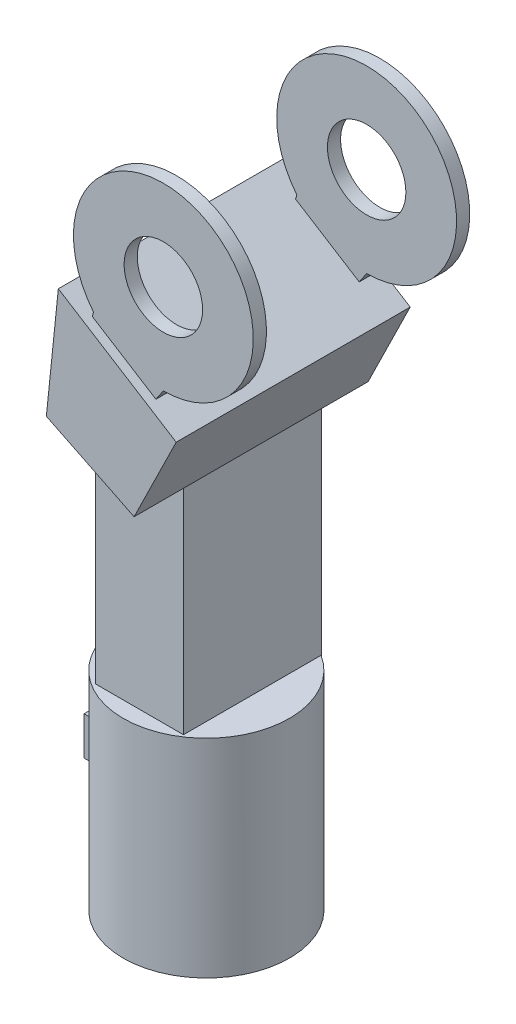
ISO-10303-21;
HEADER;
FILE_DESCRIPTION(('STEP AP214'),'2;1');
FILE_NAME('part.step','',(''),(''),'','','');
FILE_SCHEMA(('AUTOMOTIVE_DESIGN { 1 0 10303 214 1 1 1 1 }'));
ENDSEC;
DATA;
#1=APPLICATION_CONTEXT('core data for automotive mechanical design processes');
#2=APPLICATION_PROTOCOL_DEFINITION('international standard','automotive_design',2000,#1);
#3=PRODUCT_CONTEXT('',#1,'mechanical');
#4=PRODUCT('Part','Part','',(#3));
#5=PRODUCT_RELATED_PRODUCT_CATEGORY('part','',(#4));
#6=PRODUCT_DEFINITION_FORMATION('','',#4);
#7=PRODUCT_DEFINITION_CONTEXT('part definition',#1,'design');
#8=PRODUCT_DEFINITION('design','',#6,#7);
#9=PRODUCT_DEFINITION_SHAPE('','',#8);
#10=(LENGTH_UNIT() NAMED_UNIT(*) SI_UNIT(.MILLI.,.METRE.));
#11=(NAMED_UNIT(*) PLANE_ANGLE_UNIT() SI_UNIT($,.RADIAN.));
#12=(NAMED_UNIT(*) SI_UNIT($,.STERADIAN.) SOLID_ANGLE_UNIT());
#13=UNCERTAINTY_MEASURE_WITH_UNIT(LENGTH_MEASURE(1.E-05),#10,'distance_accuracy_value','');
#14=(GEOMETRIC_REPRESENTATION_CONTEXT(3) GLOBAL_UNCERTAINTY_ASSIGNED_CONTEXT((#13)) GLOBAL_UNIT_ASSIGNED_CONTEXT((#10,
#11,#12)) REPRESENTATION_CONTEXT('',''));
#15=CARTESIAN_POINT('',(0.,0.,0.));
#16=DIRECTION('',(0.,0.,1.));
#17=DIRECTION('',(1.,0.,0.));
#18=AXIS2_PLACEMENT_3D('',#15,#16,#17);
#19=CARTESIAN_POINT('',(-0.0329085029661655,-0.0154652502387762,-0.04));
#20=DIRECTION('',(0.531346970480466,0.847154293479783,0.));
#21=DIRECTION('',(-0.847154293479783,0.531346970480467,0.));
#22=AXIS2_PLACEMENT_3D('',#19,#20,#21);
#23=PLANE('',#22);
#24=DIRECTION('',(0.,0.,1.));
#25=VECTOR('',#24,1.);
#26=CARTESIAN_POINT('',(-0.0329085029661655,-0.0154652502387762,-0.04));
#27=LINE('',#26,#25);
#28=CARTESIAN_POINT('',(-0.0329085029661655,-0.0154652502387762,-0.04));
#29=VERTEX_POINT('',#28);
#30=CARTESIAN_POINT('',(-0.0329085029661655,-0.0154652502387762,0.04));
#31=VERTEX_POINT('',#30);
#32=EDGE_CURVE('E299',#29,#31,#27,.T.);
#33=ORIENTED_EDGE('',*,*,#32,.T.);
#34=DIRECTION('',(-0.847154293479783,0.531346970480467,0.));
#35=VECTOR('',#34,1.);
#36=CARTESIAN_POINT('',(-0.0329085029661655,-0.0154652502387762,0.04));
#37=LINE('',#36,#35);
#38=CARTESIAN_POINT('',(0.00739371812171949,-0.0407433645604535,0.04));
#39=VERTEX_POINT('',#38);
#40=EDGE_CURVE('E275',#39,#31,#37,.T.);
#41=ORIENTED_EDGE('',*,*,#40,.F.);
#42=DIRECTION('',(0.,0.,1.));
#43=VECTOR('',#42,1.);
#44=CARTESIAN_POINT('',(0.00739371812171949,-0.0407433645604535,-0.04));
#45=LINE('',#44,#43);
#46=CARTESIAN_POINT('',(0.00739371812171949,-0.0407433645604535,-0.04));
#47=VERTEX_POINT('',#46);
#48=EDGE_CURVE('E300',#47,#39,#45,.T.);
#49=ORIENTED_EDGE('',*,*,#48,.F.);
#50=DIRECTION('',(-0.847154293479783,0.531346970480467,0.));
#51=VECTOR('',#50,1.);
#52=CARTESIAN_POINT('',(-0.0329085029661655,-0.0154652502387762,-0.04));
#53=LINE('',#52,#51);
#54=EDGE_CURVE('E287',#47,#29,#53,.T.);
#55=ORIENTED_EDGE('',*,*,#54,.T.);
#56=EDGE_LOOP('',(#33,#41,#49,#55));
#57=FACE_BOUND('',#56,.T.);
#58=DIRECTION('',(0.847154293479783,-0.531346970480466,0.));
#59=VECTOR('',#58,1.);
#60=CARTESIAN_POINT('',(-0.0242840435920477,-0.0208746312638618,0.0325));
#61=LINE('',#60,#59);
#62=CARTESIAN_POINT('',(-0.0242840435920477,-0.0208746312638618,0.0325));
#63=VERTEX_POINT('',#62);
#64=CARTESIAN_POINT('',(-0.00254769704776513,-0.0345079705203709,0.0325));
#65=VERTEX_POINT('',#64);
#66=EDGE_CURVE('E242',#63,#65,#61,.T.);
#67=ORIENTED_EDGE('',*,*,#66,.T.);
#68=DIRECTION('',(0.,0.,-1.));
#69=VECTOR('',#68,1.);
#70=CARTESIAN_POINT('',(-0.00254769704776513,-0.0345079705203709,0.037));
#71=LINE('',#70,#69);
#72=CARTESIAN_POINT('',(-0.00254769704776513,-0.0345079705203709,0.037));
#73=VERTEX_POINT('',#72);
#74=EDGE_CURVE('E272',#73,#65,#71,.T.);
#75=ORIENTED_EDGE('',*,*,#74,.F.);
#76=DIRECTION('',(0.847154293479783,-0.531346970480466,0.));
#77=VECTOR('',#76,1.);
#78=CARTESIAN_POINT('',(-0.0242840435920477,-0.0208746312638618,0.037));
#79=LINE('',#78,#77);
#80=CARTESIAN_POINT('',(-0.0242840435920477,-0.0208746312638618,0.037));
#81=VERTEX_POINT('',#80);
#82=EDGE_CURVE('E245',#81,#73,#79,.T.);
#83=ORIENTED_EDGE('',*,*,#82,.F.);
#84=DIRECTION('',(0.,0.,-1.));
#85=VECTOR('',#84,1.);
#86=CARTESIAN_POINT('',(-0.0242840435920477,-0.0208746312638618,0.037));
#87=LINE('',#86,#85);
#88=EDGE_CURVE('E255',#81,#63,#87,.T.);
#89=ORIENTED_EDGE('',*,*,#88,.T.);
#90=EDGE_LOOP('',(#67,#75,#83,#89));
#91=FACE_BOUND('',#90,.T.);
#92=DIRECTION('',(0.,0.,1.));
#93=VECTOR('',#92,1.);
#94=CARTESIAN_POINT('',(-0.0242840435920477,-0.0208746312638618,-0.037));
#95=LINE('',#94,#93);
#96=CARTESIAN_POINT('',(-0.0242840435920477,-0.0208746312638618,-0.037));
#97=VERTEX_POINT('',#96);
#98=CARTESIAN_POINT('',(-0.0242840435920477,-0.0208746312638619,-0.0325));
#99=VERTEX_POINT('',#98);
#100=EDGE_CURVE('E54',#97,#99,#95,.T.);
#101=ORIENTED_EDGE('',*,*,#100,.F.);
#102=DIRECTION('',(0.847154293479783,-0.531346970480466,0.));
#103=VECTOR('',#102,1.);
#104=CARTESIAN_POINT('',(-0.0242840435920477,-0.0208746312638618,-0.037));
#105=LINE('',#104,#103);
#106=CARTESIAN_POINT('',(-0.00254769704776513,-0.0345079705203709,-0.037));
#107=VERTEX_POINT('',#106);
#108=EDGE_CURVE('E58',#97,#107,#105,.T.);
#109=ORIENTED_EDGE('',*,*,#108,.T.);
#110=DIRECTION('',(0.,0.,1.));
#111=VECTOR('',#110,1.);
#112=CARTESIAN_POINT('',(-0.00254769704776513,-0.0345079705203709,-0.037));
#113=LINE('',#112,#111);
#114=CARTESIAN_POINT('',(-0.00254769704776513,-0.0345079705203709,-0.0325));
#115=VERTEX_POINT('',#114);
#116=EDGE_CURVE('E210',#107,#115,#113,.T.);
#117=ORIENTED_EDGE('',*,*,#116,.T.);
#118=DIRECTION('',(0.847154293479783,-0.531346970480466,0.));
#119=VECTOR('',#118,1.);
#120=CARTESIAN_POINT('',(-0.0242840435920477,-0.0208746312638618,-0.0325));
#121=LINE('',#120,#119);
#122=EDGE_CURVE('E226',#99,#115,#121,.T.);
#123=ORIENTED_EDGE('',*,*,#122,.F.);
#124=EDGE_LOOP('',(#101,#109,#117,#123));
#125=FACE_BOUND('',#124,.T.);
#126=ADVANCED_FACE('F39',(#57,#91,#125),#23,.T.);
#127=CARTESIAN_POINT('',(-0.037,-0.0502420734633802,-0.0239939150373754));
#128=DIRECTION('',(0.,0.,-1.));
#129=DIRECTION('',(0.,1.,0.));
#130=AXIS2_PLACEMENT_3D('',#127,#128,#129);
#131=PLANE('',#130);
#132=DIRECTION('',(-0.897431435287062,0.441153962873058,0.));
#133=VECTOR('',#132,1.);
#134=CARTESIAN_POINT('',(-0.0389933634476772,-0.0542971362542646,-0.0239939150373754));
#135=LINE('',#134,#133);
#136=CARTESIAN_POINT('',(-0.007,-0.0700242419869339,-0.0239939150373754));
#137=VERTEX_POINT('',#136);
#138=CARTESIAN_POINT('',(-0.037,-0.0552770219032533,-0.0239939150373754));
#139=VERTEX_POINT('',#138);
#140=EDGE_CURVE('E314',#137,#139,#135,.T.);
#141=ORIENTED_EDGE('',*,*,#140,.F.);
#142=DIRECTION('',(0.,1.,0.));
#143=VECTOR('',#142,1.);
#144=CARTESIAN_POINT('',(-0.007,-0.0502420734633802,-0.0239939150373754));
#145=LINE('',#144,#143);
#146=CARTESIAN_POINT('',(-0.007,-0.145713330056196,-0.0239939150373754));
#147=VERTEX_POINT('',#146);
#148=EDGE_CURVE('E322',#147,#137,#145,.T.);
#149=ORIENTED_EDGE('',*,*,#148,.F.);
#150=DIRECTION('',(1.,0.,0.));
#151=VECTOR('',#150,1.);
#152=CARTESIAN_POINT('',(-0.037,-0.145713330056196,-0.0239939150373754));
#153=LINE('',#152,#151);
#154=CARTESIAN_POINT('',(-0.00713140976190437,-0.145713330056196,-0.0239939150373754));
#155=VERTEX_POINT('',#154);
#156=EDGE_CURVE('E342',#155,#147,#153,.T.);
#157=ORIENTED_EDGE('',*,*,#156,.F.);
#158=DIRECTION('',(0.,1.,0.));
#159=VECTOR('',#158,1.);
#160=CARTESIAN_POINT('',(-0.00713140976190438,-0.214,-0.0239939150373754));
#161=LINE('',#160,#159);
#162=CARTESIAN_POINT('',(-0.00713140976190437,-0.143,-0.0239939150373754));
#163=VERTEX_POINT('',#162);
#164=EDGE_CURVE('E352',#155,#163,#161,.T.);
#165=ORIENTED_EDGE('',*,*,#164,.T.);
#166=DIRECTION('',(-1.,0.,0.));
#167=VECTOR('',#166,1.);
#168=CARTESIAN_POINT('',(-0.0221553616629709,-0.143,-0.0239939150373754));
#169=LINE('',#168,#167);
#170=CARTESIAN_POINT('',(-0.037,-0.143,-0.0239939150373754));
#171=VERTEX_POINT('',#170);
#172=EDGE_CURVE('E405',#163,#171,#169,.T.);
#173=ORIENTED_EDGE('',*,*,#172,.T.);
#174=DIRECTION('',(0.,1.,0.));
#175=VECTOR('',#174,1.);
#176=CARTESIAN_POINT('',(-0.037,-0.0502420734633802,-0.0239939150373754));
#177=LINE('',#176,#175);
#178=EDGE_CURVE('E323',#171,#139,#177,.T.);
#179=ORIENTED_EDGE('',*,*,#178,.T.);
#180=EDGE_LOOP('',(#141,#149,#157,#165,#173,#179));
#181=FACE_BOUND('',#180,.T.);
#182=ADVANCED_FACE('F416',(#181),#131,.T.);
#183=CARTESIAN_POINT('',(-0.037,-0.0502420734633802,0.0231195869559997));
#184=DIRECTION('',(0.,0.,1.));
#185=DIRECTION('',(1.,0.,0.));
#186=AXIS2_PLACEMENT_3D('',#183,#184,#185);
#187=PLANE('',#186);
#188=DIRECTION('',(0.897431435287062,-0.441153962873058,0.));
#189=VECTOR('',#188,1.);
#190=CARTESIAN_POINT('',(-0.0389933634476772,-0.0542971362542646,0.0231195869559997));
#191=LINE('',#190,#189);
#192=CARTESIAN_POINT('',(-0.037,-0.0552770219032533,0.0231195869559997));
#193=VERTEX_POINT('',#192);
#194=CARTESIAN_POINT('',(-0.007,-0.0700242419869339,0.0231195869559997));
#195=VERTEX_POINT('',#194);
#196=EDGE_CURVE('E302',#193,#195,#191,.T.);
#197=ORIENTED_EDGE('',*,*,#196,.F.);
#198=DIRECTION('',(0.,-1.,0.));
#199=VECTOR('',#198,1.);
#200=CARTESIAN_POINT('',(-0.037,-0.0502420734633802,0.0231195869559997));
#201=LINE('',#200,#199);
#202=CARTESIAN_POINT('',(-0.037,-0.143,0.0231195869559997));
#203=VERTEX_POINT('',#202);
#204=EDGE_CURVE('E330',#193,#203,#201,.T.);
#205=ORIENTED_EDGE('',*,*,#204,.T.);
#206=DIRECTION('',(1.,0.,0.));
#207=VECTOR('',#206,1.);
#208=CARTESIAN_POINT('',(-0.0221553616629709,-0.143,0.0231195869559997));
#209=LINE('',#208,#207);
#210=CARTESIAN_POINT('',(-0.007,-0.143,0.0231195869559997));
#211=VERTEX_POINT('',#210);
#212=EDGE_CURVE('E399',#203,#211,#209,.T.);
#213=ORIENTED_EDGE('',*,*,#212,.T.);
#214=DIRECTION('',(0.,-1.,0.));
#215=VECTOR('',#214,1.);
#216=CARTESIAN_POINT('',(-0.007,-0.0502420734633802,0.0231195869559997));
#217=LINE('',#216,#215);
#218=EDGE_CURVE('E337',#195,#211,#217,.T.);
#219=ORIENTED_EDGE('',*,*,#218,.F.);
#220=EDGE_LOOP('',(#197,#205,#213,#219));
#221=FACE_BOUND('',#220,.T.);
#222=ADVANCED_FACE('F446',(#221),#187,.T.);
#223=CARTESIAN_POINT('',(-0.0221553616629709,-0.214,0.00015416288327999));
#224=DIRECTION('',(0.,1.,0.));
#225=DIRECTION('',(0.,0.,1.));
#226=AXIS2_PLACEMENT_3D('',#223,#224,#225);
#227=CYLINDRICAL_SURFACE('',#226,0.0284402671926198);
#228=ORIENTED_EDGE('',*,*,#164,.F.);
#229=CARTESIAN_POINT('',(-0.0221553616629709,-0.145713330056196,0.00015416288327999));
#230=DIRECTION('',(0.,-1.,0.));
#231=DIRECTION('',(0.,0.,-1.));
#232=AXIS2_PLACEMENT_3D('',#229,#230,#231);
#233=CIRCLE('',#232,0.0284402671926198);
#234=CARTESIAN_POINT('',(-0.007,-0.145713330056196,-0.0239116595803749));
#235=VERTEX_POINT('',#234);
#236=EDGE_CURVE('E47',#235,#155,#233,.F.);
#237=ORIENTED_EDGE('',*,*,#236,.F.);
#238=DIRECTION('',(0.,1.,0.));
#239=VECTOR('',#238,1.);
#240=CARTESIAN_POINT('',(-0.007,-0.214,-0.0239116595803749));
#241=LINE('',#240,#239);
#242=CARTESIAN_POINT('',(-0.007,-0.143,-0.0239116595803749));
#243=VERTEX_POINT('',#242);
#244=EDGE_CURVE('E344',#235,#243,#241,.T.);
#245=ORIENTED_EDGE('',*,*,#244,.T.);
#246=CARTESIAN_POINT('',(-0.0221553616629709,-0.143,0.00015416288327999));
#247=DIRECTION('',(0.,1.,0.));
#248=DIRECTION('',(0.,0.,1.));
#249=AXIS2_PLACEMENT_3D('',#246,#247,#248);
#250=CIRCLE('',#249,0.0284402671926198);
#251=EDGE_CURVE('E370',#163,#243,#250,.T.);
#252=ORIENTED_EDGE('',*,*,#251,.F.);
#253=EDGE_LOOP('',(#228,#237,#245,#252));
#254=FACE_BOUND('',#253,.T.);
#255=DIRECTION('',(0.,1.,0.));
#256=VECTOR('',#255,1.);
#257=CARTESIAN_POINT('',(-0.0494783687969401,-0.214,-0.00773900372744562));
#258=LINE('',#257,#256);
#259=CARTESIAN_POINT('',(-0.0494783687969401,-0.168806168927503,-0.00773900372744562));
#260=VERTEX_POINT('',#259);
#261=CARTESIAN_POINT('',(-0.0494783687969401,-0.18193801360222,-0.00773900372744562));
#262=VERTEX_POINT('',#261);
#263=EDGE_CURVE('E393',#260,#262,#258,.F.);
#264=ORIENTED_EDGE('',*,*,#263,.F.);
#265=CARTESIAN_POINT('',(-0.0221553616629709,-0.168806168927503,0.00015416288327999));
#266=DIRECTION('',(0.,1.,0.));
#267=DIRECTION('',(0.,0.,1.));
#268=AXIS2_PLACEMENT_3D('',#265,#266,#267);
#269=CIRCLE('',#268,0.0284402671926198);
#270=CARTESIAN_POINT('',(-0.0494629707332545,-0.168806168927503,0.00810043778742003));
#271=VERTEX_POINT('',#270);
#272=EDGE_CURVE('E382',#271,#260,#269,.F.);
#273=ORIENTED_EDGE('',*,*,#272,.F.);
#274=DIRECTION('',(0.,1.,0.));
#275=VECTOR('',#274,1.);
#276=CARTESIAN_POINT('',(-0.0494629707332545,-0.214,0.00810043778742003));
#277=LINE('',#276,#275);
#278=CARTESIAN_POINT('',(-0.0494629707332545,-0.18193801360222,0.00810043778742003));
#279=VERTEX_POINT('',#278);
#280=EDGE_CURVE('E387',#279,#271,#277,.T.);
#281=ORIENTED_EDGE('',*,*,#280,.F.);
#282=CARTESIAN_POINT('',(-0.0221553616629709,-0.18193801360222,0.00015416288327999));
#283=DIRECTION('',(0.,-1.,0.));
#284=DIRECTION('',(0.,0.,-1.));
#285=AXIS2_PLACEMENT_3D('',#282,#283,#284);
#286=CIRCLE('',#285,0.0284402671926198);
#287=EDGE_CURVE('E390',#262,#279,#286,.F.);
#288=ORIENTED_EDGE('',*,*,#287,.F.);
#289=EDGE_LOOP('',(#264,#273,#281,#288));
#290=FACE_BOUND('',#289,.T.);
#291=CARTESIAN_POINT('',(-0.0221553616629709,-0.214,0.00015416288327999));
#292=DIRECTION('',(0.,1.,0.));
#293=DIRECTION('',(0.,0.,1.));
#294=AXIS2_PLACEMENT_3D('',#291,#292,#293);
#295=CIRCLE('',#294,0.0284402671926198);
#296=CARTESIAN_POINT('',(-0.0221553616629709,-0.214,0.0285944300758998));
#297=VERTEX_POINT('',#296);
#298=EDGE_CURVE('E379',#297,#297,#295,.T.);
#299=ORIENTED_EDGE('',*,*,#298,.T.);
#300=EDGE_LOOP('',(#299));
#301=FACE_BOUND('',#300,.T.);
#302=ADVANCED_FACE('F41',(#254,#290,#301),#227,.T.);
#303=CARTESIAN_POINT('',(-0.0221553616629709,-0.214,0.00015416288327999));
#304=DIRECTION('',(0.,1.,0.));
#305=DIRECTION('',(0.,0.,1.));
#306=AXIS2_PLACEMENT_3D('',#303,#304,#305);
#307=PLANE('',#306);
#308=ORIENTED_EDGE('',*,*,#298,.F.);
#309=EDGE_LOOP('',(#308));
#310=FACE_BOUND('',#309,.T.);
#311=ADVANCED_FACE('F556',(#310),#307,.F.);
#312=CARTESIAN_POINT('',(-0.0221553616629709,-0.143,0.00015416288327999));
#313=DIRECTION('',(0.,1.,0.));
#314=DIRECTION('',(0.,0.,1.));
#315=AXIS2_PLACEMENT_3D('',#312,#313,#314);
#316=PLANE('',#315);
#317=ORIENTED_EDGE('',*,*,#172,.F.);
#318=ORIENTED_EDGE('',*,*,#251,.T.);
#319=DIRECTION('',(0.,0.,1.));
#320=VECTOR('',#319,1.);
#321=CARTESIAN_POINT('',(-0.007,-0.143,0.00015416288327999));
#322=LINE('',#321,#320);
#323=EDGE_CURVE('E396',#243,#211,#322,.T.);
#324=ORIENTED_EDGE('',*,*,#323,.T.);
#325=ORIENTED_EDGE('',*,*,#212,.F.);
#326=DIRECTION('',(0.,0.,1.));
#327=VECTOR('',#326,1.);
#328=CARTESIAN_POINT('',(-0.037,-0.143,0.00015416288327999));
#329=LINE('',#328,#327);
#330=EDGE_CURVE('E402',#171,#203,#329,.T.);
#331=ORIENTED_EDGE('',*,*,#330,.F.);
#332=EDGE_LOOP('',(#317,#318,#324,#325,#331));
#333=FACE_BOUND('',#332,.T.);
#334=ADVANCED_FACE('F421',(#333),#316,.T.);
#335=CARTESIAN_POINT('',(-0.056,-0.168806168927503,-0.00773900372744562));
#336=DIRECTION('',(0.,0.,-1.));
#337=DIRECTION('',(-1.,0.,0.));
#338=AXIS2_PLACEMENT_3D('',#335,#336,#337);
#339=PLANE('',#338);
#340=DIRECTION('',(1.,0.,0.));
#341=VECTOR('',#340,1.);
#342=CARTESIAN_POINT('',(-0.056,-0.168806168927503,-0.00773900372744562));
#343=LINE('',#342,#341);
#344=CARTESIAN_POINT('',(-0.056,-0.168806168927503,-0.00773900372744562));
#345=VERTEX_POINT('',#344);
#346=EDGE_CURVE('E366',#345,#260,#343,.T.);
#347=ORIENTED_EDGE('',*,*,#346,.T.);
#348=ORIENTED_EDGE('',*,*,#263,.T.);
#349=DIRECTION('',(1.,0.,0.));
#350=VECTOR('',#349,1.);
#351=CARTESIAN_POINT('',(-0.056,-0.18193801360222,-0.00773900372744562));
#352=LINE('',#351,#350);
#353=CARTESIAN_POINT('',(-0.056,-0.18193801360222,-0.00773900372744562));
#354=VERTEX_POINT('',#353);
#355=EDGE_CURVE('E367',#354,#262,#352,.T.);
#356=ORIENTED_EDGE('',*,*,#355,.F.);
#357=DIRECTION('',(0.,1.,0.));
#358=VECTOR('',#357,1.);
#359=CARTESIAN_POINT('',(-0.056,-0.168806168927503,-0.00773900372744562));
#360=LINE('',#359,#358);
#361=EDGE_CURVE('E354',#354,#345,#360,.T.);
#362=ORIENTED_EDGE('',*,*,#361,.T.);
#363=EDGE_LOOP('',(#347,#348,#356,#362));
#364=FACE_BOUND('',#363,.T.);
#365=ADVANCED_FACE('F545',(#364),#339,.T.);
#366=CARTESIAN_POINT('',(-0.056,-0.18193801360222,-0.00773900372744562));
#367=DIRECTION('',(0.,-1.,0.));
#368=DIRECTION('',(0.,0.,-1.));
#369=AXIS2_PLACEMENT_3D('',#366,#367,#368);
#370=PLANE('',#369);
#371=ORIENTED_EDGE('',*,*,#355,.T.);
#372=ORIENTED_EDGE('',*,*,#287,.T.);
#373=DIRECTION('',(1.,0.,0.));
#374=VECTOR('',#373,1.);
#375=CARTESIAN_POINT('',(-0.056,-0.18193801360222,0.00810043778742003));
#376=LINE('',#375,#374);
#377=CARTESIAN_POINT('',(-0.056,-0.18193801360222,0.00810043778742003));
#378=VERTEX_POINT('',#377);
#379=EDGE_CURVE('E371',#378,#279,#376,.T.);
#380=ORIENTED_EDGE('',*,*,#379,.F.);
#381=DIRECTION('',(0.,0.,-1.));
#382=VECTOR('',#381,1.);
#383=CARTESIAN_POINT('',(-0.056,-0.18193801360222,-0.00773900372744562));
#384=LINE('',#383,#382);
#385=EDGE_CURVE('E363',#378,#354,#384,.T.);
#386=ORIENTED_EDGE('',*,*,#385,.T.);
#387=EDGE_LOOP('',(#371,#372,#380,#386));
#388=FACE_BOUND('',#387,.T.);
#389=ADVANCED_FACE('F541',(#388),#370,.T.);
#390=CARTESIAN_POINT('',(-0.056,-0.168806168927503,0.00810043778742003));
#391=DIRECTION('',(0.,0.,1.));
#392=DIRECTION('',(1.,0.,0.));
#393=AXIS2_PLACEMENT_3D('',#390,#391,#392);
#394=PLANE('',#393);
#395=ORIENTED_EDGE('',*,*,#379,.T.);
#396=ORIENTED_EDGE('',*,*,#280,.T.);
#397=DIRECTION('',(1.,0.,0.));
#398=VECTOR('',#397,1.);
#399=CARTESIAN_POINT('',(-0.056,-0.168806168927503,0.00810043778742003));
#400=LINE('',#399,#398);
#401=CARTESIAN_POINT('',(-0.056,-0.168806168927503,0.00810043778742003));
#402=VERTEX_POINT('',#401);
#403=EDGE_CURVE('E374',#402,#271,#400,.T.);
#404=ORIENTED_EDGE('',*,*,#403,.F.);
#405=DIRECTION('',(0.,-1.,0.));
#406=VECTOR('',#405,1.);
#407=CARTESIAN_POINT('',(-0.056,-0.168806168927503,0.00810043778742003));
#408=LINE('',#407,#406);
#409=EDGE_CURVE('E360',#402,#378,#408,.T.);
#410=ORIENTED_EDGE('',*,*,#409,.T.);
#411=EDGE_LOOP('',(#395,#396,#404,#410));
#412=FACE_BOUND('',#411,.T.);
#413=ADVANCED_FACE('F544',(#412),#394,.T.);
#414=CARTESIAN_POINT('',(-0.056,-0.168806168927503,-0.00773900372744562));
#415=DIRECTION('',(0.,1.,0.));
#416=DIRECTION('',(0.,0.,1.));
#417=AXIS2_PLACEMENT_3D('',#414,#415,#416);
#418=PLANE('',#417);
#419=ORIENTED_EDGE('',*,*,#403,.T.);
#420=ORIENTED_EDGE('',*,*,#272,.T.);
#421=ORIENTED_EDGE('',*,*,#346,.F.);
#422=DIRECTION('',(0.,0.,1.));
#423=VECTOR('',#422,1.);
#424=CARTESIAN_POINT('',(-0.056,-0.168806168927503,-0.00773900372744562));
#425=LINE('',#424,#423);
#426=EDGE_CURVE('E357',#345,#402,#425,.T.);
#427=ORIENTED_EDGE('',*,*,#426,.T.);
#428=EDGE_LOOP('',(#419,#420,#421,#427));
#429=FACE_BOUND('',#428,.T.);
#430=ADVANCED_FACE('F539',(#429),#418,.T.);
#431=CARTESIAN_POINT('',(-0.056,0.,0.));
#432=DIRECTION('',(-1.,0.,0.));
#433=DIRECTION('',(0.,0.,1.));
#434=AXIS2_PLACEMENT_3D('',#431,#432,#433);
#435=PLANE('',#434);
#436=ORIENTED_EDGE('',*,*,#361,.F.);
#437=ORIENTED_EDGE('',*,*,#385,.F.);
#438=ORIENTED_EDGE('',*,*,#409,.F.);
#439=ORIENTED_EDGE('',*,*,#426,.F.);
#440=EDGE_LOOP('',(#436,#437,#438,#439));
#441=FACE_BOUND('',#440,.T.);
#442=ADVANCED_FACE('F536',(#441),#435,.T.);
#443=DIRECTION('',(0.102232570073073,0.99476052475772,0.));
#444=VECTOR('',#443,1.);
#445=CARTESIAN_POINT('',(-0.0364879612258634,-0.0502946962188617,-0.0239939150373754));
#446=LINE('',#445,#444);
#447=CARTESIAN_POINT('',(-0.0364825531307457,-0.0502420734633802,-0.0239939150373754));
#448=VERTEX_POINT('',#447);
#449=EDGE_CURVE('E320',#139,#448,#446,.T.);
#450=ORIENTED_EDGE('',*,*,#449,.F.);
#451=CARTESIAN_POINT('',(-0.037,-0.0502420734633802,-0.0239939150373754));
#452=VERTEX_POINT('',#451);
#453=EDGE_CURVE('E327',#139,#452,#177,.T.);
#454=ORIENTED_EDGE('',*,*,#453,.T.);
#455=DIRECTION('',(1.,0.,0.));
#456=VECTOR('',#455,1.);
#457=CARTESIAN_POINT('',(-0.037,-0.0502420734633802,-0.0239939150373754));
#458=LINE('',#457,#456);
#459=EDGE_CURVE('E334',#452,#448,#458,.T.);
#460=ORIENTED_EDGE('',*,*,#459,.T.);
#461=EDGE_LOOP('',(#450,#454,#460));
#462=FACE_BOUND('',#461,.T.);
#463=ADVANCED_FACE('F434',(#462),#131,.T.);
#464=CARTESIAN_POINT('',(-0.037,-0.145713330056196,-0.0239939150373754));
#465=DIRECTION('',(0.,-1.,0.));
#466=DIRECTION('',(0.,0.,-1.));
#467=AXIS2_PLACEMENT_3D('',#464,#465,#466);
#468=PLANE('',#467);
#469=DIRECTION('',(0.,0.,-1.));
#470=VECTOR('',#469,1.);
#471=CARTESIAN_POINT('',(-0.007,-0.145713330056196,-0.0239939150373754));
#472=LINE('',#471,#470);
#473=EDGE_CURVE('E339',#235,#147,#472,.T.);
#474=ORIENTED_EDGE('',*,*,#473,.F.);
#475=ORIENTED_EDGE('',*,*,#236,.T.);
#476=ORIENTED_EDGE('',*,*,#156,.T.);
#477=EDGE_LOOP('',(#474,#475,#476));
#478=FACE_BOUND('',#477,.T.);
#479=ADVANCED_FACE('F410',(#478),#468,.T.);
#480=DIRECTION('',(-0.102232570073073,-0.99476052475772,0.));
#481=VECTOR('',#480,1.);
#482=CARTESIAN_POINT('',(-0.0364879612258634,-0.0502946962188617,0.0231195869559997));
#483=LINE('',#482,#481);
#484=CARTESIAN_POINT('',(-0.0364825531307457,-0.0502420734633802,0.0231195869559997));
#485=VERTEX_POINT('',#484);
#486=EDGE_CURVE('E318',#485,#193,#483,.T.);
#487=ORIENTED_EDGE('',*,*,#486,.F.);
#488=DIRECTION('',(1.,0.,0.));
#489=VECTOR('',#488,1.);
#490=CARTESIAN_POINT('',(-0.037,-0.0502420734633802,0.0231195869559997));
#491=LINE('',#490,#489);
#492=CARTESIAN_POINT('',(-0.037,-0.0502420734633802,0.0231195869559997));
#493=VERTEX_POINT('',#492);
#494=EDGE_CURVE('E345',#493,#485,#491,.T.);
#495=ORIENTED_EDGE('',*,*,#494,.F.);
#496=EDGE_CURVE('E331',#493,#193,#201,.T.);
#497=ORIENTED_EDGE('',*,*,#496,.T.);
#498=EDGE_LOOP('',(#487,#495,#497));
#499=FACE_BOUND('',#498,.T.);
#500=ADVANCED_FACE('F443',(#499),#187,.T.);
#501=CARTESIAN_POINT('',(-0.037,-0.0502420734633802,-0.0239939150373754));
#502=DIRECTION('',(0.,1.,0.));
#503=DIRECTION('',(0.,0.,1.));
#504=AXIS2_PLACEMENT_3D('',#501,#502,#503);
#505=PLANE('',#504);
#506=DIRECTION('',(0.,0.,1.));
#507=VECTOR('',#506,1.);
#508=CARTESIAN_POINT('',(-0.0364825531307457,-0.0502420734633802,-0.0239939150373754));
#509=LINE('',#508,#507);
#510=EDGE_CURVE('E316',#448,#485,#509,.T.);
#511=ORIENTED_EDGE('',*,*,#510,.F.);
#512=ORIENTED_EDGE('',*,*,#459,.F.);
#513=DIRECTION('',(0.,0.,1.));
#514=VECTOR('',#513,1.);
#515=CARTESIAN_POINT('',(-0.037,-0.0502420734633802,-0.0239939150373754));
#516=LINE('',#515,#514);
#517=EDGE_CURVE('E326',#452,#493,#516,.T.);
#518=ORIENTED_EDGE('',*,*,#517,.T.);
#519=ORIENTED_EDGE('',*,*,#494,.T.);
#520=EDGE_LOOP('',(#511,#512,#518,#519));
#521=FACE_BOUND('',#520,.T.);
#522=ADVANCED_FACE('F437',(#521),#505,.T.);
#523=CARTESIAN_POINT('',(-0.037,0.,0.));
#524=DIRECTION('',(-1.,0.,0.));
#525=DIRECTION('',(0.,0.,1.));
#526=AXIS2_PLACEMENT_3D('',#523,#524,#525);
#527=PLANE('',#526);
#528=ORIENTED_EDGE('',*,*,#453,.F.);
#529=ORIENTED_EDGE('',*,*,#178,.F.);
#530=ORIENTED_EDGE('',*,*,#330,.T.);
#531=ORIENTED_EDGE('',*,*,#204,.F.);
#532=ORIENTED_EDGE('',*,*,#496,.F.);
#533=ORIENTED_EDGE('',*,*,#517,.F.);
#534=EDGE_LOOP('',(#528,#529,#530,#531,#532,#533));
#535=FACE_BOUND('',#534,.T.);
#536=ADVANCED_FACE('F427',(#535),#527,.T.);
#537=CARTESIAN_POINT('',(-0.007,0.,0.));
#538=DIRECTION('',(-1.,0.,0.));
#539=DIRECTION('',(0.,0.,1.));
#540=AXIS2_PLACEMENT_3D('',#537,#538,#539);
#541=PLANE('',#540);
#542=ORIENTED_EDGE('',*,*,#148,.T.);
#543=DIRECTION('',(0.,0.,1.));
#544=VECTOR('',#543,1.);
#545=CARTESIAN_POINT('',(-0.007,-0.0700242419869339,0.));
#546=LINE('',#545,#544);
#547=EDGE_CURVE('E11',#137,#195,#546,.T.);
#548=ORIENTED_EDGE('',*,*,#547,.T.);
#549=ORIENTED_EDGE('',*,*,#218,.T.);
#550=ORIENTED_EDGE('',*,*,#323,.F.);
#551=ORIENTED_EDGE('',*,*,#244,.F.);
#552=ORIENTED_EDGE('',*,*,#473,.T.);
#553=EDGE_LOOP('',(#542,#548,#549,#550,#551,#552));
#554=FACE_BOUND('',#553,.T.);
#555=ADVANCED_FACE('F452',(#554),#541,.F.);
#556=CARTESIAN_POINT('',(-0.007,-0.0700242419869339,-0.04));
#557=DIRECTION('',(-0.441153962873058,-0.897431435287062,0.));
#558=DIRECTION('',(0.897431435287062,-0.441153962873058,0.));
#559=AXIS2_PLACEMENT_3D('',#556,#557,#558);
#560=PLANE('',#559);
#561=DIRECTION('',(0.,0.,1.));
#562=VECTOR('',#561,1.);
#563=CARTESIAN_POINT('',(-0.007,-0.0700242419869339,-0.04));
#564=LINE('',#563,#562);
#565=CARTESIAN_POINT('',(-0.007,-0.0700242419869339,-0.04));
#566=VERTEX_POINT('',#565);
#567=EDGE_CURVE('E303',#566,#137,#564,.T.);
#568=ORIENTED_EDGE('',*,*,#567,.T.);
#569=ORIENTED_EDGE('',*,*,#140,.T.);
#570=DIRECTION('',(0.,0.,1.));
#571=VECTOR('',#570,1.);
#572=CARTESIAN_POINT('',(-0.037,-0.0552770219032533,-0.04));
#573=LINE('',#572,#571);
#574=CARTESIAN_POINT('',(-0.037,-0.0552770219032533,-0.04));
#575=VERTEX_POINT('',#574);
#576=EDGE_CURVE('E307',#575,#139,#573,.T.);
#577=ORIENTED_EDGE('',*,*,#576,.F.);
#578=DIRECTION('',(0.897431435287062,-0.441153962873058,0.));
#579=VECTOR('',#578,1.);
#580=CARTESIAN_POINT('',(-0.007,-0.0700242419869339,-0.04));
#581=LINE('',#580,#579);
#582=EDGE_CURVE('E293',#575,#566,#581,.T.);
#583=ORIENTED_EDGE('',*,*,#582,.T.);
#584=EDGE_LOOP('',(#568,#569,#577,#583));
#585=FACE_BOUND('',#584,.T.);
#586=ADVANCED_FACE('F457',(#585),#560,.T.);
#587=CARTESIAN_POINT('',(0.00739371812171949,-0.0407433645604535,-0.04));
#588=DIRECTION('',(0.897431435287062,-0.441153962873058,0.));
#589=DIRECTION('',(0.441153962873058,0.897431435287062,0.));
#590=AXIS2_PLACEMENT_3D('',#587,#588,#589);
#591=PLANE('',#590);
#592=ORIENTED_EDGE('',*,*,#48,.T.);
#593=DIRECTION('',(0.441153962873058,0.897431435287062,0.));
#594=VECTOR('',#593,1.);
#595=CARTESIAN_POINT('',(0.00739371812171949,-0.0407433645604535,0.04));
#596=LINE('',#595,#594);
#597=CARTESIAN_POINT('',(-0.007,-0.0700242419869339,0.04));
#598=VERTEX_POINT('',#597);
#599=EDGE_CURVE('E284',#598,#39,#596,.T.);
#600=ORIENTED_EDGE('',*,*,#599,.F.);
#601=EDGE_CURVE('E306',#195,#598,#564,.T.);
#602=ORIENTED_EDGE('',*,*,#601,.F.);
#603=ORIENTED_EDGE('',*,*,#547,.F.);
#604=ORIENTED_EDGE('',*,*,#567,.F.);
#605=DIRECTION('',(0.441153962873058,0.897431435287062,0.));
#606=VECTOR('',#605,1.);
#607=CARTESIAN_POINT('',(0.00739371812171949,-0.0407433645604535,-0.04));
#608=LINE('',#607,#606);
#609=EDGE_CURVE('E296',#566,#47,#608,.T.);
#610=ORIENTED_EDGE('',*,*,#609,.T.);
#611=EDGE_LOOP('',(#592,#600,#602,#603,#604,#610));
#612=FACE_BOUND('',#611,.T.);
#613=ADVANCED_FACE('F454',(#612),#591,.T.);
#614=CARTESIAN_POINT('',(-0.037,-0.0552770219032533,0.04));
#615=VERTEX_POINT('',#614);
#616=EDGE_CURVE('E310',#193,#615,#573,.T.);
#617=ORIENTED_EDGE('',*,*,#616,.F.);
#618=ORIENTED_EDGE('',*,*,#196,.T.);
#619=ORIENTED_EDGE('',*,*,#601,.T.);
#620=DIRECTION('',(0.897431435287062,-0.441153962873058,0.));
#621=VECTOR('',#620,1.);
#622=CARTESIAN_POINT('',(-0.007,-0.0700242419869339,0.04));
#623=LINE('',#622,#621);
#624=EDGE_CURVE('E281',#615,#598,#623,.T.);
#625=ORIENTED_EDGE('',*,*,#624,.F.);
#626=EDGE_LOOP('',(#617,#618,#619,#625));
#627=FACE_BOUND('',#626,.T.);
#628=ADVANCED_FACE('F449',(#627),#560,.T.);
#629=CARTESIAN_POINT('',(-0.037,-0.0552770219032533,-0.04));
#630=DIRECTION('',(-0.99476052475772,0.102232570073073,0.));
#631=DIRECTION('',(-0.102232570073073,-0.99476052475772,0.));
#632=AXIS2_PLACEMENT_3D('',#629,#630,#631);
#633=PLANE('',#632);
#634=ORIENTED_EDGE('',*,*,#576,.T.);
#635=ORIENTED_EDGE('',*,*,#449,.T.);
#636=ORIENTED_EDGE('',*,*,#510,.T.);
#637=ORIENTED_EDGE('',*,*,#486,.T.);
#638=ORIENTED_EDGE('',*,*,#616,.T.);
#639=DIRECTION('',(-0.102232570073073,-0.99476052475772,0.));
#640=VECTOR('',#639,1.);
#641=CARTESIAN_POINT('',(-0.037,-0.0552770219032533,0.04));
#642=LINE('',#641,#640);
#643=EDGE_CURVE('E278',#31,#615,#642,.T.);
#644=ORIENTED_EDGE('',*,*,#643,.F.);
#645=ORIENTED_EDGE('',*,*,#32,.F.);
#646=DIRECTION('',(-0.102232570073073,-0.99476052475772,0.));
#647=VECTOR('',#646,1.);
#648=CARTESIAN_POINT('',(-0.037,-0.0552770219032533,-0.04));
#649=LINE('',#648,#647);
#650=EDGE_CURVE('E290',#29,#575,#649,.T.);
#651=ORIENTED_EDGE('',*,*,#650,.T.);
#652=EDGE_LOOP('',(#634,#635,#636,#637,#638,#644,#645,#651));
#653=FACE_BOUND('',#652,.T.);
#654=ADVANCED_FACE('F440',(#653),#633,.T.);
#655=CARTESIAN_POINT('',(0.,0.,-0.04));
#656=DIRECTION('',(0.,0.,-1.));
#657=DIRECTION('',(-1.,0.,0.));
#658=AXIS2_PLACEMENT_3D('',#655,#656,#657);
#659=PLANE('',#658);
#660=ORIENTED_EDGE('',*,*,#54,.F.);
#661=ORIENTED_EDGE('',*,*,#609,.F.);
#662=ORIENTED_EDGE('',*,*,#582,.F.);
#663=ORIENTED_EDGE('',*,*,#650,.F.);
#664=EDGE_LOOP('',(#660,#661,#662,#663));
#665=FACE_BOUND('',#664,.T.);
#666=ADVANCED_FACE('F463',(#665),#659,.T.);
#667=CARTESIAN_POINT('',(0.,0.,0.04));
#668=DIRECTION('',(0.,0.,-1.));
#669=DIRECTION('',(-1.,0.,0.));
#670=AXIS2_PLACEMENT_3D('',#667,#668,#669);
#671=PLANE('',#670);
#672=ORIENTED_EDGE('',*,*,#40,.T.);
#673=ORIENTED_EDGE('',*,*,#643,.T.);
#674=ORIENTED_EDGE('',*,*,#624,.T.);
#675=ORIENTED_EDGE('',*,*,#599,.T.);
#676=EDGE_LOOP('',(#672,#673,#674,#675));
#677=FACE_BOUND('',#676,.T.);
#678=ADVANCED_FACE('F467',(#677),#671,.F.);
#679=CARTESIAN_POINT('',(0.,0.,0.037));
#680=DIRECTION('',(0.,0.,1.));
#681=DIRECTION('',(1.,0.,0.));
#682=AXIS2_PLACEMENT_3D('',#679,#680,#681);
#683=PLANE('',#682);
#684=ORIENTED_EDGE('',*,*,#82,.T.);
#685=DIRECTION('',(0.560650712680681,0.828052400739618,0.));
#686=VECTOR('',#685,1.);
#687=CARTESIAN_POINT('',(-0.00254769704776513,-0.0345079705203709,0.037));
#688=LINE('',#687,#686);
#689=CARTESIAN_POINT('',(0.,-0.0307451524073389,0.037));
#690=VERTEX_POINT('',#689);
#691=EDGE_CURVE('E248',#73,#690,#688,.T.);
#692=ORIENTED_EDGE('',*,*,#691,.T.);
#693=CARTESIAN_POINT('',(0.,0.,0.037));
#694=DIRECTION('',(0.,0.,1.));
#695=DIRECTION('',(1.,0.,0.));
#696=AXIS2_PLACEMENT_3D('',#693,#694,#695);
#697=CIRCLE('',#696,0.0307451524073389);
#698=CARTESIAN_POINT('',(-0.0238803156725334,-0.0193647855637663,0.037));
#699=VERTEX_POINT('',#698);
#700=EDGE_CURVE('E251',#690,#699,#697,.T.);
#701=ORIENTED_EDGE('',*,*,#700,.T.);
#702=DIRECTION('',(-0.258321120789114,-0.966059107174223,0.));
#703=VECTOR('',#702,1.);
#704=CARTESIAN_POINT('',(-0.0242840435920477,-0.0208746312638618,0.037));
#705=LINE('',#704,#703);
#706=EDGE_CURVE('E253',#699,#81,#705,.T.);
#707=ORIENTED_EDGE('',*,*,#706,.T.);
#708=EDGE_LOOP('',(#684,#692,#701,#707));
#709=FACE_BOUND('',#708,.T.);
#710=CARTESIAN_POINT('',(0.,0.,0.037));
#711=DIRECTION('',(0.,0.,1.));
#712=DIRECTION('',(1.,0.,0.));
#713=AXIS2_PLACEMENT_3D('',#710,#711,#712);
#714=CIRCLE('',#713,0.0134107716866279);
#715=CARTESIAN_POINT('',(0.0134107716866279,0.,0.037));
#716=VERTEX_POINT('',#715);
#717=EDGE_CURVE('E239',#716,#716,#714,.T.);
#718=ORIENTED_EDGE('',*,*,#717,.F.);
#719=EDGE_LOOP('',(#718));
#720=FACE_BOUND('',#719,.T.);
#721=ADVANCED_FACE('F491',(#709,#720),#683,.T.);
#722=CARTESIAN_POINT('',(0.,0.,0.0325));
#723=DIRECTION('',(0.,0.,1.));
#724=DIRECTION('',(1.,0.,0.));
#725=AXIS2_PLACEMENT_3D('',#722,#723,#724);
#726=PLANE('',#725);
#727=ORIENTED_EDGE('',*,*,#66,.F.);
#728=DIRECTION('',(-0.258321120789114,-0.966059107174223,0.));
#729=VECTOR('',#728,1.);
#730=CARTESIAN_POINT('',(-0.0242840435920477,-0.0208746312638618,0.0325));
#731=LINE('',#730,#729);
#732=CARTESIAN_POINT('',(-0.0238803156725334,-0.0193647855637663,0.0325));
#733=VERTEX_POINT('',#732);
#734=EDGE_CURVE('E249',#733,#63,#731,.T.);
#735=ORIENTED_EDGE('',*,*,#734,.F.);
#736=CARTESIAN_POINT('',(0.,0.,0.0325));
#737=DIRECTION('',(0.,0.,1.));
#738=DIRECTION('',(1.,0.,0.));
#739=AXIS2_PLACEMENT_3D('',#736,#737,#738);
#740=CIRCLE('',#739,0.0307451524073389);
#741=CARTESIAN_POINT('',(0.,-0.0307451524073389,0.0325));
#742=VERTEX_POINT('',#741);
#743=EDGE_CURVE('E260',#742,#733,#740,.T.);
#744=ORIENTED_EDGE('',*,*,#743,.F.);
#745=DIRECTION('',(0.560650712680681,0.828052400739618,0.));
#746=VECTOR('',#745,1.);
#747=CARTESIAN_POINT('',(-0.00254769704776513,-0.0345079705203709,0.0325));
#748=LINE('',#747,#746);
#749=EDGE_CURVE('E258',#65,#742,#748,.T.);
#750=ORIENTED_EDGE('',*,*,#749,.F.);
#751=EDGE_LOOP('',(#727,#735,#744,#750));
#752=FACE_BOUND('',#751,.T.);
#753=CARTESIAN_POINT('',(0.,0.,0.0325));
#754=DIRECTION('',(0.,0.,1.));
#755=DIRECTION('',(1.,0.,0.));
#756=AXIS2_PLACEMENT_3D('',#753,#754,#755);
#757=CIRCLE('',#756,0.0134107716866279);
#758=CARTESIAN_POINT('',(0.0134107716866279,0.,0.0325));
#759=VERTEX_POINT('',#758);
#760=EDGE_CURVE('E236',#759,#759,#757,.T.);
#761=ORIENTED_EDGE('',*,*,#760,.T.);
#762=EDGE_LOOP('',(#761));
#763=FACE_BOUND('',#762,.T.);
#764=ADVANCED_FACE('F477',(#752,#763),#726,.F.);
#765=CARTESIAN_POINT('',(-0.00254769704776513,-0.0345079705203709,0.037));
#766=DIRECTION('',(-0.828052400739618,0.560650712680681,0.));
#767=DIRECTION('',(-0.560650712680681,-0.828052400739618,0.));
#768=AXIS2_PLACEMENT_3D('',#765,#766,#767);
#769=PLANE('',#768);
#770=ORIENTED_EDGE('',*,*,#749,.T.);
#771=DIRECTION('',(0.,0.,-1.));
#772=VECTOR('',#771,1.);
#773=CARTESIAN_POINT('',(0.,-0.0307451524073389,0.037));
#774=LINE('',#773,#772);
#775=EDGE_CURVE('E269',#690,#742,#774,.T.);
#776=ORIENTED_EDGE('',*,*,#775,.F.);
#777=ORIENTED_EDGE('',*,*,#691,.F.);
#778=ORIENTED_EDGE('',*,*,#74,.T.);
#779=EDGE_LOOP('',(#770,#776,#777,#778));
#780=FACE_BOUND('',#779,.T.);
#781=ADVANCED_FACE('F489',(#780),#769,.F.);
#782=CARTESIAN_POINT('',(0.,0.,0.037));
#783=DIRECTION('',(0.,0.,-1.));
#784=DIRECTION('',(-1.,0.,0.));
#785=AXIS2_PLACEMENT_3D('',#782,#783,#784);
#786=CYLINDRICAL_SURFACE('',#785,0.0307451524073389);
#787=ORIENTED_EDGE('',*,*,#743,.T.);
#788=DIRECTION('',(0.,0.,-1.));
#789=VECTOR('',#788,1.);
#790=CARTESIAN_POINT('',(-0.0238803156725334,-0.0193647855637663,0.037));
#791=LINE('',#790,#789);
#792=EDGE_CURVE('E266',#699,#733,#791,.T.);
#793=ORIENTED_EDGE('',*,*,#792,.F.);
#794=ORIENTED_EDGE('',*,*,#700,.F.);
#795=ORIENTED_EDGE('',*,*,#775,.T.);
#796=EDGE_LOOP('',(#787,#793,#794,#795));
#797=FACE_BOUND('',#796,.T.);
#798=ADVANCED_FACE('F486',(#797),#786,.T.);
#799=CARTESIAN_POINT('',(-0.0242840435920477,-0.0208746312638618,0.037));
#800=DIRECTION('',(0.966059107174223,-0.258321120789114,0.));
#801=DIRECTION('',(0.258321120789114,0.966059107174223,0.));
#802=AXIS2_PLACEMENT_3D('',#799,#800,#801);
#803=PLANE('',#802);
#804=ORIENTED_EDGE('',*,*,#734,.T.);
#805=ORIENTED_EDGE('',*,*,#88,.F.);
#806=ORIENTED_EDGE('',*,*,#706,.F.);
#807=ORIENTED_EDGE('',*,*,#792,.T.);
#808=EDGE_LOOP('',(#804,#805,#806,#807));
#809=FACE_BOUND('',#808,.T.);
#810=ADVANCED_FACE('F481',(#809),#803,.F.);
#811=CARTESIAN_POINT('',(0.,0.,0.037));
#812=DIRECTION('',(0.,0.,-1.));
#813=DIRECTION('',(-1.,0.,0.));
#814=AXIS2_PLACEMENT_3D('',#811,#812,#813);
#815=CYLINDRICAL_SURFACE('',#814,0.0134107716866279);
#816=ORIENTED_EDGE('',*,*,#717,.T.);
#817=EDGE_LOOP('',(#816));
#818=FACE_BOUND('',#817,.T.);
#819=ORIENTED_EDGE('',*,*,#760,.F.);
#820=EDGE_LOOP('',(#819));
#821=FACE_BOUND('',#820,.T.);
#822=ADVANCED_FACE('F497',(#818,#821),#815,.F.);
#823=CARTESIAN_POINT('',(-0.0242840435920477,-0.0208746312638618,-0.037));
#824=DIRECTION('',(-0.966059107174223,0.258321120789114,0.));
#825=DIRECTION('',(-0.258321120789114,-0.966059107174223,0.));
#826=AXIS2_PLACEMENT_3D('',#823,#824,#825);
#827=PLANE('',#826);
#828=DIRECTION('',(-0.258321120789114,-0.966059107174223,0.));
#829=VECTOR('',#828,1.);
#830=CARTESIAN_POINT('',(-0.0242840435920477,-0.0208746312638618,-0.0325));
#831=LINE('',#830,#829);
#832=CARTESIAN_POINT('',(-0.0238803156725334,-0.0193647855637663,-0.0325));
#833=VERTEX_POINT('',#832);
#834=EDGE_CURVE('E221',#833,#99,#831,.T.);
#835=ORIENTED_EDGE('',*,*,#834,.F.);
#836=DIRECTION('',(0.,0.,1.));
#837=VECTOR('',#836,1.);
#838=CARTESIAN_POINT('',(-0.0238803156725334,-0.0193647855637663,-0.037));
#839=LINE('',#838,#837);
#840=CARTESIAN_POINT('',(-0.0238803156725334,-0.0193647855637663,-0.037));
#841=VERTEX_POINT('',#840);
#842=EDGE_CURVE('E209',#841,#833,#839,.T.);
#843=ORIENTED_EDGE('',*,*,#842,.F.);
#844=DIRECTION('',(-0.258321120789114,-0.966059107174223,0.));
#845=VECTOR('',#844,1.);
#846=CARTESIAN_POINT('',(-0.0242840435920477,-0.0208746312638618,-0.037));
#847=LINE('',#846,#845);
#848=EDGE_CURVE('E217',#841,#97,#847,.T.);
#849=ORIENTED_EDGE('',*,*,#848,.T.);
#850=ORIENTED_EDGE('',*,*,#100,.T.);
#851=EDGE_LOOP('',(#835,#843,#849,#850));
#852=FACE_BOUND('',#851,.T.);
#853=ADVANCED_FACE('F500',(#852),#827,.T.);
#854=CARTESIAN_POINT('',(0.,0.,-0.037));
#855=DIRECTION('',(0.,0.,1.));
#856=DIRECTION('',(1.,0.,0.));
#857=AXIS2_PLACEMENT_3D('',#854,#855,#856);
#858=CYLINDRICAL_SURFACE('',#857,0.0307451524073389);
#859=CARTESIAN_POINT('',(0.,0.,-0.0325));
#860=DIRECTION('',(0.,0.,1.));
#861=DIRECTION('',(1.,0.,0.));
#862=AXIS2_PLACEMENT_3D('',#859,#860,#861);
#863=CIRCLE('',#862,0.0307451524073389);
#864=CARTESIAN_POINT('',(0.,-0.0307451524073389,-0.0325));
#865=VERTEX_POINT('',#864);
#866=EDGE_CURVE('E204',#865,#833,#863,.T.);
#867=ORIENTED_EDGE('',*,*,#866,.F.);
#868=DIRECTION('',(0.,0.,1.));
#869=VECTOR('',#868,1.);
#870=CARTESIAN_POINT('',(0.,-0.0307451524073389,-0.037));
#871=LINE('',#870,#869);
#872=CARTESIAN_POINT('',(0.,-0.0307451524073389,-0.037));
#873=VERTEX_POINT('',#872);
#874=EDGE_CURVE('E198',#873,#865,#871,.T.);
#875=ORIENTED_EDGE('',*,*,#874,.F.);
#876=CARTESIAN_POINT('',(0.,0.,-0.037));
#877=DIRECTION('',(0.,0.,1.));
#878=DIRECTION('',(1.,0.,0.));
#879=AXIS2_PLACEMENT_3D('',#876,#877,#878);
#880=CIRCLE('',#879,0.0307451524073389);
#881=EDGE_CURVE('E201',#873,#841,#880,.T.);
#882=ORIENTED_EDGE('',*,*,#881,.T.);
#883=ORIENTED_EDGE('',*,*,#842,.T.);
#884=EDGE_LOOP('',(#867,#875,#882,#883));
#885=FACE_BOUND('',#884,.T.);
#886=ADVANCED_FACE('F200',(#885),#858,.T.);
#887=CARTESIAN_POINT('',(-0.00254769704776513,-0.0345079705203709,-0.037));
#888=DIRECTION('',(0.828052400739618,-0.560650712680681,0.));
#889=DIRECTION('',(0.560650712680681,0.828052400739618,0.));
#890=AXIS2_PLACEMENT_3D('',#887,#888,#889);
#891=PLANE('',#890);
#892=DIRECTION('',(0.560650712680681,0.828052400739618,0.));
#893=VECTOR('',#892,1.);
#894=CARTESIAN_POINT('',(-0.00254769704776513,-0.0345079705203709,-0.0325));
#895=LINE('',#894,#893);
#896=EDGE_CURVE('E229',#115,#865,#895,.T.);
#897=ORIENTED_EDGE('',*,*,#896,.F.);
#898=ORIENTED_EDGE('',*,*,#116,.F.);
#899=DIRECTION('',(0.560650712680681,0.828052400739618,0.));
#900=VECTOR('',#899,1.);
#901=CARTESIAN_POINT('',(-0.00254769704776513,-0.0345079705203709,-0.037));
#902=LINE('',#901,#900);
#903=EDGE_CURVE('E215',#107,#873,#902,.T.);
#904=ORIENTED_EDGE('',*,*,#903,.T.);
#905=ORIENTED_EDGE('',*,*,#874,.T.);
#906=EDGE_LOOP('',(#897,#898,#904,#905));
#907=FACE_BOUND('',#906,.T.);
#908=ADVANCED_FACE('F219',(#907),#891,.T.);
#909=CARTESIAN_POINT('',(0.,0.,-0.037));
#910=DIRECTION('',(0.,0.,1.));
#911=DIRECTION('',(1.,0.,0.));
#912=AXIS2_PLACEMENT_3D('',#909,#910,#911);
#913=PLANE('',#912);
#914=CARTESIAN_POINT('',(0.,0.,-0.037));
#915=DIRECTION('',(0.,0.,1.));
#916=DIRECTION('',(1.,0.,0.));
#917=AXIS2_PLACEMENT_3D('',#914,#915,#916);
#918=CIRCLE('',#917,0.0134107716866279);
#919=CARTESIAN_POINT('',(0.0134107716866279,0.,-0.037));
#920=VERTEX_POINT('',#919);
#921=EDGE_CURVE('E230',#920,#920,#918,.T.);
#922=ORIENTED_EDGE('',*,*,#921,.T.);
#923=EDGE_LOOP('',(#922));
#924=FACE_BOUND('',#923,.T.);
#925=ORIENTED_EDGE('',*,*,#108,.F.);
#926=ORIENTED_EDGE('',*,*,#848,.F.);
#927=ORIENTED_EDGE('',*,*,#881,.F.);
#928=ORIENTED_EDGE('',*,*,#903,.F.);
#929=EDGE_LOOP('',(#925,#926,#927,#928));
#930=FACE_BOUND('',#929,.T.);
#931=ADVANCED_FACE('F214',(#924,#930),#913,.F.);
#932=CARTESIAN_POINT('',(0.,0.,-0.0325));
#933=DIRECTION('',(0.,0.,1.));
#934=DIRECTION('',(1.,0.,0.));
#935=AXIS2_PLACEMENT_3D('',#932,#933,#934);
#936=PLANE('',#935);
#937=CARTESIAN_POINT('',(0.,0.,-0.0325));
#938=DIRECTION('',(0.,0.,1.));
#939=DIRECTION('',(1.,0.,0.));
#940=AXIS2_PLACEMENT_3D('',#937,#938,#939);
#941=CIRCLE('',#940,0.0134107716866279);
#942=CARTESIAN_POINT('',(0.0134107716866279,0.,-0.0325));
#943=VERTEX_POINT('',#942);
#944=EDGE_CURVE('E741',#943,#943,#941,.T.);
#945=ORIENTED_EDGE('',*,*,#944,.F.);
#946=EDGE_LOOP('',(#945));
#947=FACE_BOUND('',#946,.T.);
#948=ORIENTED_EDGE('',*,*,#122,.T.);
#949=ORIENTED_EDGE('',*,*,#896,.T.);
#950=ORIENTED_EDGE('',*,*,#866,.T.);
#951=ORIENTED_EDGE('',*,*,#834,.T.);
#952=EDGE_LOOP('',(#948,#949,#950,#951));
#953=FACE_BOUND('',#952,.T.);
#954=ADVANCED_FACE('F713',(#947,#953),#936,.T.);
#955=CARTESIAN_POINT('',(0.,0.,-0.037));
#956=DIRECTION('',(0.,0.,1.));
#957=DIRECTION('',(1.,0.,0.));
#958=AXIS2_PLACEMENT_3D('',#955,#956,#957);
#959=CYLINDRICAL_SURFACE('',#958,0.0134107716866279);
#960=ORIENTED_EDGE('',*,*,#921,.F.);
#961=EDGE_LOOP('',(#960));
#962=FACE_BOUND('',#961,.T.);
#963=ORIENTED_EDGE('',*,*,#944,.T.);
#964=EDGE_LOOP('',(#963));
#965=FACE_BOUND('',#964,.T.);
#966=ADVANCED_FACE('F723',(#962,#965),#959,.F.);
#967=CLOSED_SHELL('',(#126,#182,#222,#302,#311,#334,#365,#389,#413,#430,#442,#463,#479,#500,
#522,#536,#555,#586,#613,#628,#654,#666,#678,#721,#764,#781,#798,#810,#822,#853,#886,#908,#931,
#954,#966));
#968=MANIFOLD_SOLID_BREP('B2',#967);
#969=ADVANCED_BREP_SHAPE_REPRESENTATION('',(#18,#968),#14);
#970=SHAPE_DEFINITION_REPRESENTATION(#9,#969);
ENDSEC;
END-ISO-10303-21;
